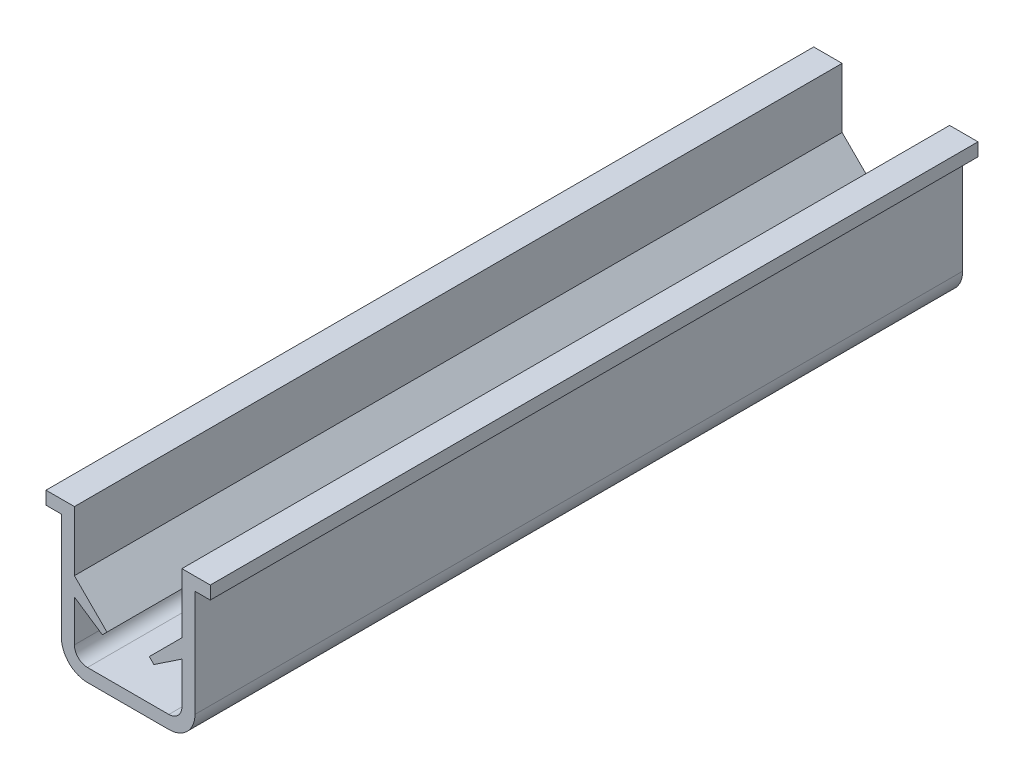
ISO-10303-21;
HEADER;
FILE_DESCRIPTION(('STEP AP214'),'2;1');
FILE_NAME('part.step','',(''),(''),'','','');
FILE_SCHEMA(('AUTOMOTIVE_DESIGN { 1 0 10303 214 1 1 1 1 }'));
ENDSEC;
DATA;
#1=APPLICATION_CONTEXT('core data for automotive mechanical design processes');
#2=APPLICATION_PROTOCOL_DEFINITION('international standard','automotive_design',2000,#1);
#3=PRODUCT_CONTEXT('',#1,'mechanical');
#4=PRODUCT('Part','Part','',(#3));
#5=PRODUCT_RELATED_PRODUCT_CATEGORY('part','',(#4));
#6=PRODUCT_DEFINITION_FORMATION('','',#4);
#7=PRODUCT_DEFINITION_CONTEXT('part definition',#1,'design');
#8=PRODUCT_DEFINITION('design','',#6,#7);
#9=PRODUCT_DEFINITION_SHAPE('','',#8);
#10=(LENGTH_UNIT() NAMED_UNIT(*) SI_UNIT(.MILLI.,.METRE.));
#11=(NAMED_UNIT(*) PLANE_ANGLE_UNIT() SI_UNIT($,.RADIAN.));
#12=(NAMED_UNIT(*) SI_UNIT($,.STERADIAN.) SOLID_ANGLE_UNIT());
#13=UNCERTAINTY_MEASURE_WITH_UNIT(LENGTH_MEASURE(1.E-05),#10,'distance_accuracy_value','');
#14=(GEOMETRIC_REPRESENTATION_CONTEXT(3) GLOBAL_UNCERTAINTY_ASSIGNED_CONTEXT((#13)) GLOBAL_UNIT_ASSIGNED_CONTEXT((#10,
#11,#12)) REPRESENTATION_CONTEXT('',''));
#15=CARTESIAN_POINT('',(0.,0.,0.));
#16=DIRECTION('',(0.,0.,1.));
#17=DIRECTION('',(1.,0.,0.));
#18=AXIS2_PLACEMENT_3D('',#15,#16,#17);
#19=CARTESIAN_POINT('',(-0.947399507109134,-2.0460129960833,50.));
#20=DIRECTION('',(-0.707106781186547,-0.707106781186547,0.));
#21=DIRECTION('',(0.707106781186548,-0.707106781186548,0.));
#22=AXIS2_PLACEMENT_3D('',#19,#20,#21);
#23=PLANE('',#22);
#24=DIRECTION('',(-0.707106781186547,0.707106781186547,0.));
#25=VECTOR('',#24,1.);
#26=CARTESIAN_POINT('',(-0.947399507109134,-2.0460129960833,0.));
#27=LINE('',#26,#25);
#28=CARTESIAN_POINT('',(-0.947399507109134,-2.0460129960833,0.));
#29=VERTEX_POINT('',#28);
#30=CARTESIAN_POINT('',(-3.06871985066814,0.0753073474757116,0.));
#31=VERTEX_POINT('',#30);
#32=EDGE_CURVE('E223',#29,#31,#27,.T.);
#33=ORIENTED_EDGE('',*,*,#32,.T.);
#34=DIRECTION('',(0.,0.,-1.));
#35=VECTOR('',#34,1.);
#36=CARTESIAN_POINT('',(-3.06871985066814,0.0753073474757116,50.));
#37=LINE('',#36,#35);
#38=CARTESIAN_POINT('',(-3.06871985066814,0.0753073474757116,50.));
#39=VERTEX_POINT('',#38);
#40=EDGE_CURVE('E11',#39,#31,#37,.T.);
#41=ORIENTED_EDGE('',*,*,#40,.F.);
#42=DIRECTION('',(-0.707106781186547,0.707106781186547,0.));
#43=VECTOR('',#42,1.);
#44=CARTESIAN_POINT('',(-0.947399507109134,-2.0460129960833,50.));
#45=LINE('',#44,#43);
#46=CARTESIAN_POINT('',(-0.947399507109134,-2.0460129960833,50.));
#47=VERTEX_POINT('',#46);
#48=EDGE_CURVE('E269',#47,#39,#45,.T.);
#49=ORIENTED_EDGE('',*,*,#48,.F.);
#50=DIRECTION('',(0.,0.,-1.));
#51=VECTOR('',#50,1.);
#52=CARTESIAN_POINT('',(-0.947399507109134,-2.0460129960833,50.));
#53=LINE('',#52,#51);
#54=EDGE_CURVE('E219',#47,#29,#53,.T.);
#55=ORIENTED_EDGE('',*,*,#54,.T.);
#56=EDGE_LOOP('',(#33,#41,#49,#55));
#57=FACE_BOUND('',#56,.T.);
#58=ADVANCED_FACE('F31',(#57),#23,.F.);
#59=CARTESIAN_POINT('',(-3.06871985066814,0.0753073474757116,50.));
#60=DIRECTION('',(-1.,0.,0.));
#61=DIRECTION('',(0.,0.,1.));
#62=AXIS2_PLACEMENT_3D('',#59,#60,#61);
#63=PLANE('',#62);
#64=DIRECTION('',(0.,1.,0.));
#65=VECTOR('',#64,1.);
#66=CARTESIAN_POINT('',(-3.06871985066814,0.0753073474757116,0.));
#67=LINE('',#66,#65);
#68=CARTESIAN_POINT('',(-3.06871985066814,3.9753073474755,0.));
#69=VERTEX_POINT('',#68);
#70=EDGE_CURVE('E226',#31,#69,#67,.T.);
#71=ORIENTED_EDGE('',*,*,#70,.T.);
#72=DIRECTION('',(0.,0.,-1.));
#73=VECTOR('',#72,1.);
#74=CARTESIAN_POINT('',(-3.06871985066814,3.9753073474755,50.));
#75=LINE('',#74,#73);
#76=CARTESIAN_POINT('',(-3.06871985066814,3.9753073474755,50.));
#77=VERTEX_POINT('',#76);
#78=EDGE_CURVE('E39',#77,#69,#75,.T.);
#79=ORIENTED_EDGE('',*,*,#78,.F.);
#80=DIRECTION('',(0.,1.,0.));
#81=VECTOR('',#80,1.);
#82=CARTESIAN_POINT('',(-3.06871985066814,0.0753073474757116,50.));
#83=LINE('',#82,#81);
#84=EDGE_CURVE('E138',#39,#77,#83,.T.);
#85=ORIENTED_EDGE('',*,*,#84,.F.);
#86=ORIENTED_EDGE('',*,*,#40,.T.);
#87=EDGE_LOOP('',(#71,#79,#85,#86));
#88=FACE_BOUND('',#87,.T.);
#89=ADVANCED_FACE('F407',(#88),#63,.F.);
#90=CARTESIAN_POINT('',(-3.06871985066814,3.9753073474755,50.));
#91=DIRECTION('',(0.,-1.,0.));
#92=DIRECTION('',(0.,0.,-1.));
#93=AXIS2_PLACEMENT_3D('',#90,#91,#92);
#94=PLANE('',#93);
#95=DIRECTION('',(-1.,0.,0.));
#96=VECTOR('',#95,1.);
#97=CARTESIAN_POINT('',(-3.06871985066814,3.9753073474755,0.));
#98=LINE('',#97,#96);
#99=CARTESIAN_POINT('',(-4.91871985066855,3.9753073474755,0.));
#100=VERTEX_POINT('',#99);
#101=EDGE_CURVE('E228',#69,#100,#98,.T.);
#102=ORIENTED_EDGE('',*,*,#101,.T.);
#103=DIRECTION('',(0.,0.,-1.));
#104=VECTOR('',#103,1.);
#105=CARTESIAN_POINT('',(-4.91871985066855,3.9753073474755,50.));
#106=LINE('',#105,#104);
#107=CARTESIAN_POINT('',(-4.91871985066855,3.9753073474755,50.));
#108=VERTEX_POINT('',#107);
#109=EDGE_CURVE('E324',#108,#100,#106,.T.);
#110=ORIENTED_EDGE('',*,*,#109,.F.);
#111=DIRECTION('',(-1.,0.,0.));
#112=VECTOR('',#111,1.);
#113=CARTESIAN_POINT('',(-3.06871985066814,3.9753073474755,50.));
#114=LINE('',#113,#112);
#115=EDGE_CURVE('E332',#77,#108,#114,.T.);
#116=ORIENTED_EDGE('',*,*,#115,.F.);
#117=ORIENTED_EDGE('',*,*,#78,.T.);
#118=EDGE_LOOP('',(#102,#110,#116,#117));
#119=FACE_BOUND('',#118,.T.);
#120=ADVANCED_FACE('F330',(#119),#94,.F.);
#121=CARTESIAN_POINT('',(-4.91871985066855,3.9753073474755,50.));
#122=DIRECTION('',(1.,0.,0.));
#123=DIRECTION('',(0.,0.,-1.));
#124=AXIS2_PLACEMENT_3D('',#121,#122,#123);
#125=PLANE('',#124);
#126=DIRECTION('',(0.,-1.,0.));
#127=VECTOR('',#126,1.);
#128=CARTESIAN_POINT('',(-4.91871985066855,3.9753073474755,0.));
#129=LINE('',#128,#127);
#130=CARTESIAN_POINT('',(-4.91871985066855,3.12530734747543,0.));
#131=VERTEX_POINT('',#130);
#132=EDGE_CURVE('E230',#100,#131,#129,.T.);
#133=ORIENTED_EDGE('',*,*,#132,.T.);
#134=DIRECTION('',(0.,0.,-1.));
#135=VECTOR('',#134,1.);
#136=CARTESIAN_POINT('',(-4.91871985066855,3.12530734747543,50.));
#137=LINE('',#136,#135);
#138=CARTESIAN_POINT('',(-4.91871985066855,3.12530734747543,50.));
#139=VERTEX_POINT('',#138);
#140=EDGE_CURVE('E321',#139,#131,#137,.T.);
#141=ORIENTED_EDGE('',*,*,#140,.F.);
#142=DIRECTION('',(0.,-1.,0.));
#143=VECTOR('',#142,1.);
#144=CARTESIAN_POINT('',(-4.91871985066855,3.9753073474755,50.));
#145=LINE('',#144,#143);
#146=EDGE_CURVE('E350',#108,#139,#145,.T.);
#147=ORIENTED_EDGE('',*,*,#146,.F.);
#148=ORIENTED_EDGE('',*,*,#109,.T.);
#149=EDGE_LOOP('',(#133,#141,#147,#148));
#150=FACE_BOUND('',#149,.T.);
#151=ADVANCED_FACE('F341',(#150),#125,.F.);
#152=CARTESIAN_POINT('',(-4.91871985066855,3.12530734747543,50.));
#153=DIRECTION('',(0.,1.,0.));
#154=DIRECTION('',(-1.,0.,0.));
#155=AXIS2_PLACEMENT_3D('',#152,#153,#154);
#156=PLANE('',#155);
#157=DIRECTION('',(1.,0.,0.));
#158=VECTOR('',#157,1.);
#159=CARTESIAN_POINT('',(-4.91871985066855,3.12530734747543,0.));
#160=LINE('',#159,#158);
#161=CARTESIAN_POINT('',(-3.91871985066855,3.12530734747546,0.));
#162=VERTEX_POINT('',#161);
#163=EDGE_CURVE('E232',#131,#162,#160,.T.);
#164=ORIENTED_EDGE('',*,*,#163,.T.);
#165=DIRECTION('',(0.,0.,-1.));
#166=VECTOR('',#165,1.);
#167=CARTESIAN_POINT('',(-3.91871985066855,3.12530734747546,50.));
#168=LINE('',#167,#166);
#169=CARTESIAN_POINT('',(-3.91871985066855,3.12530734747546,50.));
#170=VERTEX_POINT('',#169);
#171=EDGE_CURVE('E318',#170,#162,#168,.T.);
#172=ORIENTED_EDGE('',*,*,#171,.F.);
#173=DIRECTION('',(1.,0.,0.));
#174=VECTOR('',#173,1.);
#175=CARTESIAN_POINT('',(-4.91871985066855,3.12530734747543,50.));
#176=LINE('',#175,#174);
#177=EDGE_CURVE('E347',#139,#170,#176,.T.);
#178=ORIENTED_EDGE('',*,*,#177,.F.);
#179=ORIENTED_EDGE('',*,*,#140,.T.);
#180=EDGE_LOOP('',(#164,#172,#178,#179));
#181=FACE_BOUND('',#180,.T.);
#182=ADVANCED_FACE('F345',(#181),#156,.F.);
#183=CARTESIAN_POINT('',(-3.91871985066855,3.12530734747546,50.));
#184=DIRECTION('',(1.,0.,0.));
#185=DIRECTION('',(0.,0.,-1.));
#186=AXIS2_PLACEMENT_3D('',#183,#184,#185);
#187=PLANE('',#186);
#188=DIRECTION('',(0.,-1.,0.));
#189=VECTOR('',#188,1.);
#190=CARTESIAN_POINT('',(-3.91871985066855,3.12530734747546,0.));
#191=LINE('',#190,#189);
#192=CARTESIAN_POINT('',(-3.91871985066855,-3.82469265252469,0.));
#193=VERTEX_POINT('',#192);
#194=EDGE_CURVE('E234',#162,#193,#191,.T.);
#195=ORIENTED_EDGE('',*,*,#194,.T.);
#196=DIRECTION('',(0.,0.,-1.));
#197=VECTOR('',#196,1.);
#198=CARTESIAN_POINT('',(-3.91871985066855,-3.82469265252469,50.));
#199=LINE('',#198,#197);
#200=CARTESIAN_POINT('',(-3.91871985066855,-3.82469265252469,50.));
#201=VERTEX_POINT('',#200);
#202=EDGE_CURVE('E315',#201,#193,#199,.T.);
#203=ORIENTED_EDGE('',*,*,#202,.F.);
#204=DIRECTION('',(0.,-1.,0.));
#205=VECTOR('',#204,1.);
#206=CARTESIAN_POINT('',(-3.91871985066855,3.12530734747546,50.));
#207=LINE('',#206,#205);
#208=EDGE_CURVE('E349',#170,#201,#207,.T.);
#209=ORIENTED_EDGE('',*,*,#208,.F.);
#210=ORIENTED_EDGE('',*,*,#171,.T.);
#211=EDGE_LOOP('',(#195,#203,#209,#210));
#212=FACE_BOUND('',#211,.T.);
#213=ADVANCED_FACE('F420',(#212),#187,.F.);
#214=CARTESIAN_POINT('',(-2.21871985066857,-3.82469265252464,50.));
#215=DIRECTION('',(0.,0.,-1.));
#216=DIRECTION('',(-1.,0.,0.));
#217=AXIS2_PLACEMENT_3D('',#214,#215,#216);
#218=CYLINDRICAL_SURFACE('',#217,1.69999999999998);
#219=CARTESIAN_POINT('',(-2.21871985066857,-3.82469265252464,0.));
#220=DIRECTION('',(0.,0.,1.));
#221=DIRECTION('',(1.,0.,0.));
#222=AXIS2_PLACEMENT_3D('',#219,#220,#221);
#223=CIRCLE('',#222,1.69999999999998);
#224=CARTESIAN_POINT('',(-2.21871985066852,-5.52469265252462,0.));
#225=VERTEX_POINT('',#224);
#226=EDGE_CURVE('E236',#193,#225,#223,.T.);
#227=ORIENTED_EDGE('',*,*,#226,.T.);
#228=DIRECTION('',(0.,0.,-1.));
#229=VECTOR('',#228,1.);
#230=CARTESIAN_POINT('',(-2.21871985066852,-5.52469265252462,50.));
#231=LINE('',#230,#229);
#232=CARTESIAN_POINT('',(-2.21871985066852,-5.52469265252462,50.));
#233=VERTEX_POINT('',#232);
#234=EDGE_CURVE('E312',#233,#225,#231,.T.);
#235=ORIENTED_EDGE('',*,*,#234,.F.);
#236=CARTESIAN_POINT('',(-2.21871985066857,-3.82469265252464,50.));
#237=DIRECTION('',(0.,0.,1.));
#238=DIRECTION('',(1.,0.,0.));
#239=AXIS2_PLACEMENT_3D('',#236,#237,#238);
#240=CIRCLE('',#239,1.69999999999998);
#241=EDGE_CURVE('E352',#201,#233,#240,.T.);
#242=ORIENTED_EDGE('',*,*,#241,.F.);
#243=ORIENTED_EDGE('',*,*,#202,.T.);
#244=EDGE_LOOP('',(#227,#235,#242,#243));
#245=FACE_BOUND('',#244,.T.);
#246=ADVANCED_FACE('F423',(#245),#218,.T.);
#247=CARTESIAN_POINT('',(-2.21871985066852,-5.52469265252462,50.));
#248=DIRECTION('',(0.,1.,0.));
#249=DIRECTION('',(-1.,0.,0.));
#250=AXIS2_PLACEMENT_3D('',#247,#248,#249);
#251=PLANE('',#250);
#252=DIRECTION('',(1.,0.,0.));
#253=VECTOR('',#252,1.);
#254=CARTESIAN_POINT('',(-2.21871985066852,-5.52469265252462,0.));
#255=LINE('',#254,#253);
#256=CARTESIAN_POINT('',(3.08128014933146,-5.5246926525245,0.));
#257=VERTEX_POINT('',#256);
#258=EDGE_CURVE('E238',#225,#257,#255,.T.);
#259=ORIENTED_EDGE('',*,*,#258,.T.);
#260=DIRECTION('',(0.,0.,-1.));
#261=VECTOR('',#260,1.);
#262=CARTESIAN_POINT('',(3.08128014933146,-5.5246926525245,50.));
#263=LINE('',#262,#261);
#264=CARTESIAN_POINT('',(3.08128014933146,-5.5246926525245,50.));
#265=VERTEX_POINT('',#264);
#266=EDGE_CURVE('E309',#265,#257,#263,.T.);
#267=ORIENTED_EDGE('',*,*,#266,.F.);
#268=DIRECTION('',(1.,0.,0.));
#269=VECTOR('',#268,1.);
#270=CARTESIAN_POINT('',(-2.21871985066852,-5.52469265252462,50.));
#271=LINE('',#270,#269);
#272=EDGE_CURVE('E358',#233,#265,#271,.T.);
#273=ORIENTED_EDGE('',*,*,#272,.F.);
#274=ORIENTED_EDGE('',*,*,#234,.T.);
#275=EDGE_LOOP('',(#259,#267,#273,#274));
#276=FACE_BOUND('',#275,.T.);
#277=ADVANCED_FACE('F427',(#276),#251,.F.);
#278=CARTESIAN_POINT('',(3.08128014933218,-3.82469265252275,50.));
#279=DIRECTION('',(0.,0.,-1.));
#280=DIRECTION('',(-1.,0.,0.));
#281=AXIS2_PLACEMENT_3D('',#278,#279,#280);
#282=CYLINDRICAL_SURFACE('',#281,1.70000000000181);
#283=CARTESIAN_POINT('',(3.08128014933218,-3.82469265252275,0.));
#284=DIRECTION('',(0.,0.,1.));
#285=DIRECTION('',(1.,0.,0.));
#286=AXIS2_PLACEMENT_3D('',#283,#284,#285);
#287=CIRCLE('',#286,1.70000000000181);
#288=CARTESIAN_POINT('',(4.78128014933399,-3.82469265252278,0.));
#289=VERTEX_POINT('',#288);
#290=EDGE_CURVE('E240',#257,#289,#287,.T.);
#291=ORIENTED_EDGE('',*,*,#290,.T.);
#292=DIRECTION('',(0.,0.,-1.));
#293=VECTOR('',#292,1.);
#294=CARTESIAN_POINT('',(4.78128014933399,-3.82469265252278,50.));
#295=LINE('',#294,#293);
#296=CARTESIAN_POINT('',(4.78128014933399,-3.82469265252278,50.));
#297=VERTEX_POINT('',#296);
#298=EDGE_CURVE('E306',#297,#289,#295,.T.);
#299=ORIENTED_EDGE('',*,*,#298,.F.);
#300=CARTESIAN_POINT('',(3.08128014933218,-3.82469265252275,50.));
#301=DIRECTION('',(0.,0.,1.));
#302=DIRECTION('',(1.,0.,0.));
#303=AXIS2_PLACEMENT_3D('',#300,#301,#302);
#304=CIRCLE('',#303,1.70000000000181);
#305=EDGE_CURVE('E360',#265,#297,#304,.T.);
#306=ORIENTED_EDGE('',*,*,#305,.F.);
#307=ORIENTED_EDGE('',*,*,#266,.T.);
#308=EDGE_LOOP('',(#291,#299,#306,#307));
#309=FACE_BOUND('',#308,.T.);
#310=ADVANCED_FACE('F431',(#309),#282,.T.);
#311=CARTESIAN_POINT('',(4.78128014933404,-3.82469265252278,50.));
#312=DIRECTION('',(-1.,0.,0.));
#313=DIRECTION('',(0.,0.,1.));
#314=AXIS2_PLACEMENT_3D('',#311,#312,#313);
#315=PLANE('',#314);
#316=DIRECTION('',(0.,1.,0.));
#317=VECTOR('',#316,1.);
#318=CARTESIAN_POINT('',(4.78128014933404,-3.82469265252278,0.));
#319=LINE('',#318,#317);
#320=CARTESIAN_POINT('',(4.78128014933404,3.12530734747712,0.));
#321=VERTEX_POINT('',#320);
#322=EDGE_CURVE('E242',#289,#321,#319,.T.);
#323=ORIENTED_EDGE('',*,*,#322,.T.);
#324=DIRECTION('',(0.,0.,-1.));
#325=VECTOR('',#324,1.);
#326=CARTESIAN_POINT('',(4.78128014933404,3.12530734747712,50.));
#327=LINE('',#326,#325);
#328=CARTESIAN_POINT('',(4.78128014933404,3.12530734747712,50.));
#329=VERTEX_POINT('',#328);
#330=EDGE_CURVE('E303',#329,#321,#327,.T.);
#331=ORIENTED_EDGE('',*,*,#330,.F.);
#332=DIRECTION('',(0.,1.,0.));
#333=VECTOR('',#332,1.);
#334=CARTESIAN_POINT('',(4.78128014933404,-3.82469265252278,50.));
#335=LINE('',#334,#333);
#336=EDGE_CURVE('E362',#297,#329,#335,.T.);
#337=ORIENTED_EDGE('',*,*,#336,.F.);
#338=ORIENTED_EDGE('',*,*,#298,.T.);
#339=EDGE_LOOP('',(#323,#331,#337,#338));
#340=FACE_BOUND('',#339,.T.);
#341=ADVANCED_FACE('F435',(#340),#315,.F.);
#342=CARTESIAN_POINT('',(4.78128014933404,3.12530734747712,50.));
#343=DIRECTION('',(0.,1.,0.));
#344=DIRECTION('',(0.,0.,1.));
#345=AXIS2_PLACEMENT_3D('',#342,#343,#344);
#346=PLANE('',#345);
#347=DIRECTION('',(1.,0.,0.));
#348=VECTOR('',#347,1.);
#349=CARTESIAN_POINT('',(4.78128014933404,3.12530734747712,0.));
#350=LINE('',#349,#348);
#351=CARTESIAN_POINT('',(5.78128014933404,3.12530734747712,0.));
#352=VERTEX_POINT('',#351);
#353=EDGE_CURVE('E244',#321,#352,#350,.T.);
#354=ORIENTED_EDGE('',*,*,#353,.T.);
#355=DIRECTION('',(0.,0.,-1.));
#356=VECTOR('',#355,1.);
#357=CARTESIAN_POINT('',(5.78128014933404,3.12530734747712,50.));
#358=LINE('',#357,#356);
#359=CARTESIAN_POINT('',(5.78128014933404,3.12530734747712,50.));
#360=VERTEX_POINT('',#359);
#361=EDGE_CURVE('E300',#360,#352,#358,.T.);
#362=ORIENTED_EDGE('',*,*,#361,.F.);
#363=DIRECTION('',(1.,0.,0.));
#364=VECTOR('',#363,1.);
#365=CARTESIAN_POINT('',(4.78128014933404,3.12530734747712,50.));
#366=LINE('',#365,#364);
#367=EDGE_CURVE('E364',#329,#360,#366,.T.);
#368=ORIENTED_EDGE('',*,*,#367,.F.);
#369=ORIENTED_EDGE('',*,*,#330,.T.);
#370=EDGE_LOOP('',(#354,#362,#368,#369));
#371=FACE_BOUND('',#370,.T.);
#372=ADVANCED_FACE('F439',(#371),#346,.F.);
#373=CARTESIAN_POINT('',(5.78128014933404,3.12530734747712,50.));
#374=DIRECTION('',(-1.,0.,0.));
#375=DIRECTION('',(0.,0.,1.));
#376=AXIS2_PLACEMENT_3D('',#373,#374,#375);
#377=PLANE('',#376);
#378=DIRECTION('',(0.,1.,0.));
#379=VECTOR('',#378,1.);
#380=CARTESIAN_POINT('',(5.78128014933404,3.12530734747712,0.));
#381=LINE('',#380,#379);
#382=CARTESIAN_POINT('',(5.78128014933404,3.9753073474777,0.));
#383=VERTEX_POINT('',#382);
#384=EDGE_CURVE('E246',#352,#383,#381,.T.);
#385=ORIENTED_EDGE('',*,*,#384,.T.);
#386=DIRECTION('',(0.,0.,-1.));
#387=VECTOR('',#386,1.);
#388=CARTESIAN_POINT('',(5.78128014933404,3.9753073474777,50.));
#389=LINE('',#388,#387);
#390=CARTESIAN_POINT('',(5.78128014933404,3.9753073474777,50.));
#391=VERTEX_POINT('',#390);
#392=EDGE_CURVE('E297',#391,#383,#389,.T.);
#393=ORIENTED_EDGE('',*,*,#392,.F.);
#394=DIRECTION('',(0.,1.,0.));
#395=VECTOR('',#394,1.);
#396=CARTESIAN_POINT('',(5.78128014933404,3.12530734747712,50.));
#397=LINE('',#396,#395);
#398=EDGE_CURVE('E366',#360,#391,#397,.T.);
#399=ORIENTED_EDGE('',*,*,#398,.F.);
#400=ORIENTED_EDGE('',*,*,#361,.T.);
#401=EDGE_LOOP('',(#385,#393,#399,#400));
#402=FACE_BOUND('',#401,.T.);
#403=ADVANCED_FACE('F443',(#402),#377,.F.);
#404=CARTESIAN_POINT('',(5.78128014933404,3.9753073474777,50.));
#405=DIRECTION('',(0.,-1.,0.));
#406=DIRECTION('',(0.,0.,-1.));
#407=AXIS2_PLACEMENT_3D('',#404,#405,#406);
#408=PLANE('',#407);
#409=DIRECTION('',(-1.,0.,0.));
#410=VECTOR('',#409,1.);
#411=CARTESIAN_POINT('',(5.78128014933404,3.9753073474777,0.));
#412=LINE('',#411,#410);
#413=CARTESIAN_POINT('',(3.93128014933306,3.9753073474777,0.));
#414=VERTEX_POINT('',#413);
#415=EDGE_CURVE('E248',#383,#414,#412,.T.);
#416=ORIENTED_EDGE('',*,*,#415,.T.);
#417=DIRECTION('',(0.,0.,-1.));
#418=VECTOR('',#417,1.);
#419=CARTESIAN_POINT('',(3.93128014933306,3.9753073474777,50.));
#420=LINE('',#419,#418);
#421=CARTESIAN_POINT('',(3.93128014933306,3.9753073474777,50.));
#422=VERTEX_POINT('',#421);
#423=EDGE_CURVE('E294',#422,#414,#420,.T.);
#424=ORIENTED_EDGE('',*,*,#423,.F.);
#425=DIRECTION('',(-1.,0.,0.));
#426=VECTOR('',#425,1.);
#427=CARTESIAN_POINT('',(5.78128014933404,3.9753073474777,50.));
#428=LINE('',#427,#426);
#429=EDGE_CURVE('E368',#391,#422,#428,.T.);
#430=ORIENTED_EDGE('',*,*,#429,.F.);
#431=ORIENTED_EDGE('',*,*,#392,.T.);
#432=EDGE_LOOP('',(#416,#424,#430,#431));
#433=FACE_BOUND('',#432,.T.);
#434=ADVANCED_FACE('F447',(#433),#408,.F.);
#435=CARTESIAN_POINT('',(3.93128014933306,3.9753073474777,50.));
#436=DIRECTION('',(1.,0.,0.));
#437=DIRECTION('',(0.,0.,-1.));
#438=AXIS2_PLACEMENT_3D('',#435,#436,#437);
#439=PLANE('',#438);
#440=DIRECTION('',(0.,-1.,0.));
#441=VECTOR('',#440,1.);
#442=CARTESIAN_POINT('',(3.93128014933306,3.9753073474777,0.));
#443=LINE('',#442,#441);
#444=CARTESIAN_POINT('',(3.93128014933306,0.0753073474759613,0.));
#445=VERTEX_POINT('',#444);
#446=EDGE_CURVE('E250',#414,#445,#443,.T.);
#447=ORIENTED_EDGE('',*,*,#446,.T.);
#448=DIRECTION('',(0.,0.,-1.));
#449=VECTOR('',#448,1.);
#450=CARTESIAN_POINT('',(3.93128014933306,0.0753073474759613,50.));
#451=LINE('',#450,#449);
#452=CARTESIAN_POINT('',(3.93128014933306,0.0753073474759613,50.));
#453=VERTEX_POINT('',#452);
#454=EDGE_CURVE('E291',#453,#445,#451,.T.);
#455=ORIENTED_EDGE('',*,*,#454,.F.);
#456=DIRECTION('',(0.,-1.,0.));
#457=VECTOR('',#456,1.);
#458=CARTESIAN_POINT('',(3.93128014933306,3.9753073474777,50.));
#459=LINE('',#458,#457);
#460=EDGE_CURVE('E370',#422,#453,#459,.T.);
#461=ORIENTED_EDGE('',*,*,#460,.F.);
#462=ORIENTED_EDGE('',*,*,#423,.T.);
#463=EDGE_LOOP('',(#447,#455,#461,#462));
#464=FACE_BOUND('',#463,.T.);
#465=ADVANCED_FACE('F451',(#464),#439,.F.);
#466=CARTESIAN_POINT('',(3.93128014933306,0.0753073474759613,50.));
#467=DIRECTION('',(0.707106781186547,-0.707106781186547,0.));
#468=DIRECTION('',(0.707106781186548,0.707106781186548,0.));
#469=AXIS2_PLACEMENT_3D('',#466,#467,#468);
#470=PLANE('',#469);
#471=DIRECTION('',(-0.707106781186547,-0.707106781186547,0.));
#472=VECTOR('',#471,1.);
#473=CARTESIAN_POINT('',(3.93128014933306,0.0753073474759613,0.));
#474=LINE('',#473,#472);
#475=CARTESIAN_POINT('',(1.80995980577503,-2.04601299608206,0.));
#476=VERTEX_POINT('',#475);
#477=EDGE_CURVE('E252',#445,#476,#474,.T.);
#478=ORIENTED_EDGE('',*,*,#477,.T.);
#479=DIRECTION('',(0.,0.,-1.));
#480=VECTOR('',#479,1.);
#481=CARTESIAN_POINT('',(1.80995980577503,-2.04601299608206,50.));
#482=LINE('',#481,#480);
#483=CARTESIAN_POINT('',(1.80995980577503,-2.04601299608206,50.));
#484=VERTEX_POINT('',#483);
#485=EDGE_CURVE('E288',#484,#476,#482,.T.);
#486=ORIENTED_EDGE('',*,*,#485,.F.);
#487=DIRECTION('',(-0.707106781186547,-0.707106781186547,0.));
#488=VECTOR('',#487,1.);
#489=CARTESIAN_POINT('',(3.93128014933306,0.0753073474759613,50.));
#490=LINE('',#489,#488);
#491=EDGE_CURVE('E372',#453,#484,#490,.T.);
#492=ORIENTED_EDGE('',*,*,#491,.F.);
#493=ORIENTED_EDGE('',*,*,#454,.T.);
#494=EDGE_LOOP('',(#478,#486,#492,#493));
#495=FACE_BOUND('',#494,.T.);
#496=ADVANCED_FACE('F455',(#495),#470,.F.);
#497=CARTESIAN_POINT('',(1.80995980577503,-2.04601299608206,50.));
#498=DIRECTION('',(0.707106781186548,0.707106781186548,0.));
#499=DIRECTION('',(-0.707106781186548,0.707106781186548,0.));
#500=AXIS2_PLACEMENT_3D('',#497,#498,#499);
#501=PLANE('',#500);
#502=DIRECTION('',(0.707106781186548,-0.707106781186548,0.));
#503=VECTOR('',#502,1.);
#504=CARTESIAN_POINT('',(1.80995980577503,-2.04601299608206,0.));
#505=LINE('',#504,#503);
#506=CARTESIAN_POINT('',(2.11048018777957,-2.3465333780866,0.));
#507=VERTEX_POINT('',#506);
#508=EDGE_CURVE('E254',#476,#507,#505,.T.);
#509=ORIENTED_EDGE('',*,*,#508,.T.);
#510=DIRECTION('',(0.,0.,-1.));
#511=VECTOR('',#510,1.);
#512=CARTESIAN_POINT('',(2.11048018777957,-2.3465333780866,50.));
#513=LINE('',#512,#511);
#514=CARTESIAN_POINT('',(2.11048018777957,-2.3465333780866,50.));
#515=VERTEX_POINT('',#514);
#516=EDGE_CURVE('E285',#515,#507,#513,.T.);
#517=ORIENTED_EDGE('',*,*,#516,.F.);
#518=DIRECTION('',(0.707106781186548,-0.707106781186548,0.));
#519=VECTOR('',#518,1.);
#520=CARTESIAN_POINT('',(1.80995980577503,-2.04601299608206,50.));
#521=LINE('',#520,#519);
#522=EDGE_CURVE('E374',#484,#515,#521,.T.);
#523=ORIENTED_EDGE('',*,*,#522,.F.);
#524=ORIENTED_EDGE('',*,*,#485,.T.);
#525=EDGE_LOOP('',(#509,#517,#523,#524));
#526=FACE_BOUND('',#525,.T.);
#527=ADVANCED_FACE('F459',(#526),#501,.F.);
#528=CARTESIAN_POINT('',(2.11048018777957,-2.3465333780866,50.));
#529=DIRECTION('',(-0.556560213550804,0.830807275300526,0.));
#530=DIRECTION('',(-0.830807275300526,-0.556560213550804,0.));
#531=AXIS2_PLACEMENT_3D('',#528,#529,#530);
#532=PLANE('',#531);
#533=DIRECTION('',(0.830807275300525,0.556560213550804,0.));
#534=VECTOR('',#533,1.);
#535=CARTESIAN_POINT('',(2.11048018777957,-2.3465333780866,0.));
#536=LINE('',#535,#534);
#537=CARTESIAN_POINT('',(3.93128014933289,-1.12677418054125,0.));
#538=VERTEX_POINT('',#537);
#539=EDGE_CURVE('E256',#507,#538,#536,.T.);
#540=ORIENTED_EDGE('',*,*,#539,.T.);
#541=DIRECTION('',(0.,0.,-1.));
#542=VECTOR('',#541,1.);
#543=CARTESIAN_POINT('',(3.93128014933289,-1.12677418054125,50.));
#544=LINE('',#543,#542);
#545=CARTESIAN_POINT('',(3.93128014933289,-1.12677418054125,50.));
#546=VERTEX_POINT('',#545);
#547=EDGE_CURVE('E282',#546,#538,#544,.T.);
#548=ORIENTED_EDGE('',*,*,#547,.F.);
#549=DIRECTION('',(0.830807275300525,0.556560213550804,0.));
#550=VECTOR('',#549,1.);
#551=CARTESIAN_POINT('',(2.11048018777957,-2.3465333780866,50.));
#552=LINE('',#551,#550);
#553=EDGE_CURVE('E376',#515,#546,#552,.T.);
#554=ORIENTED_EDGE('',*,*,#553,.F.);
#555=ORIENTED_EDGE('',*,*,#516,.T.);
#556=EDGE_LOOP('',(#540,#548,#554,#555));
#557=FACE_BOUND('',#556,.T.);
#558=ADVANCED_FACE('F463',(#557),#532,.F.);
#559=CARTESIAN_POINT('',(3.93128014933289,-1.12677418054125,50.));
#560=DIRECTION('',(1.,0.,0.));
#561=DIRECTION('',(0.,0.,-1.));
#562=AXIS2_PLACEMENT_3D('',#559,#560,#561);
#563=PLANE('',#562);
#564=DIRECTION('',(0.,-1.,0.));
#565=VECTOR('',#564,1.);
#566=CARTESIAN_POINT('',(3.93128014933289,-1.12677418054125,0.));
#567=LINE('',#566,#565);
#568=CARTESIAN_POINT('',(3.93128014933289,-3.82469265252258,0.));
#569=VERTEX_POINT('',#568);
#570=EDGE_CURVE('E258',#538,#569,#567,.T.);
#571=ORIENTED_EDGE('',*,*,#570,.T.);
#572=DIRECTION('',(0.,0.,-1.));
#573=VECTOR('',#572,1.);
#574=CARTESIAN_POINT('',(3.93128014933289,-3.82469265252258,50.));
#575=LINE('',#574,#573);
#576=CARTESIAN_POINT('',(3.93128014933289,-3.82469265252258,50.));
#577=VERTEX_POINT('',#576);
#578=EDGE_CURVE('E279',#577,#569,#575,.T.);
#579=ORIENTED_EDGE('',*,*,#578,.F.);
#580=DIRECTION('',(0.,-1.,0.));
#581=VECTOR('',#580,1.);
#582=CARTESIAN_POINT('',(3.93128014933289,-1.12677418054125,50.));
#583=LINE('',#582,#581);
#584=EDGE_CURVE('E378',#546,#577,#583,.T.);
#585=ORIENTED_EDGE('',*,*,#584,.F.);
#586=ORIENTED_EDGE('',*,*,#547,.T.);
#587=EDGE_LOOP('',(#571,#579,#585,#586));
#588=FACE_BOUND('',#587,.T.);
#589=ADVANCED_FACE('F467',(#588),#563,.F.);
#590=CARTESIAN_POINT('',(3.08128014933218,-3.82469265252275,50.));
#591=DIRECTION('',(0.,0.,-1.));
#592=DIRECTION('',(-1.,0.,0.));
#593=AXIS2_PLACEMENT_3D('',#590,#591,#592);
#594=CYLINDRICAL_SURFACE('',#593,0.850000000000711);
#595=CARTESIAN_POINT('',(3.08128014933218,-3.82469265252275,0.));
#596=DIRECTION('',(0.,0.,-1.));
#597=DIRECTION('',(1.,0.,0.));
#598=AXIS2_PLACEMENT_3D('',#595,#596,#597);
#599=CIRCLE('',#598,0.850000000000711);
#600=CARTESIAN_POINT('',(3.08128014933329,-4.67469265252346,0.));
#601=VERTEX_POINT('',#600);
#602=EDGE_CURVE('E260',#569,#601,#599,.T.);
#603=ORIENTED_EDGE('',*,*,#602,.T.);
#604=DIRECTION('',(0.,0.,-1.));
#605=VECTOR('',#604,1.);
#606=CARTESIAN_POINT('',(3.08128014933329,-4.67469265252346,50.));
#607=LINE('',#606,#605);
#608=CARTESIAN_POINT('',(3.08128014933329,-4.67469265252346,50.));
#609=VERTEX_POINT('',#608);
#610=EDGE_CURVE('E276',#609,#601,#607,.T.);
#611=ORIENTED_EDGE('',*,*,#610,.F.);
#612=CARTESIAN_POINT('',(3.08128014933218,-3.82469265252275,50.));
#613=DIRECTION('',(0.,0.,-1.));
#614=DIRECTION('',(1.,0.,0.));
#615=AXIS2_PLACEMENT_3D('',#612,#613,#614);
#616=CIRCLE('',#615,0.850000000000711);
#617=EDGE_CURVE('E380',#577,#609,#616,.T.);
#618=ORIENTED_EDGE('',*,*,#617,.F.);
#619=ORIENTED_EDGE('',*,*,#578,.T.);
#620=EDGE_LOOP('',(#603,#611,#618,#619));
#621=FACE_BOUND('',#620,.T.);
#622=ADVANCED_FACE('F471',(#621),#594,.F.);
#623=CARTESIAN_POINT('',(3.08128014933329,-4.67469265252346,50.));
#624=DIRECTION('',(0.,-1.,0.));
#625=DIRECTION('',(0.,0.,-1.));
#626=AXIS2_PLACEMENT_3D('',#623,#624,#625);
#627=PLANE('',#626);
#628=DIRECTION('',(-1.,0.,0.));
#629=VECTOR('',#628,1.);
#630=CARTESIAN_POINT('',(3.08128014933329,-4.67469265252346,0.));
#631=LINE('',#630,#629);
#632=CARTESIAN_POINT('',(-2.21871985066785,-4.67469265252346,0.));
#633=VERTEX_POINT('',#632);
#634=EDGE_CURVE('E262',#601,#633,#631,.T.);
#635=ORIENTED_EDGE('',*,*,#634,.T.);
#636=DIRECTION('',(0.,0.,-1.));
#637=VECTOR('',#636,1.);
#638=CARTESIAN_POINT('',(-2.21871985066785,-4.67469265252346,50.));
#639=LINE('',#638,#637);
#640=CARTESIAN_POINT('',(-2.21871985066785,-4.67469265252346,50.));
#641=VERTEX_POINT('',#640);
#642=EDGE_CURVE('E273',#641,#633,#639,.T.);
#643=ORIENTED_EDGE('',*,*,#642,.F.);
#644=DIRECTION('',(-1.,0.,0.));
#645=VECTOR('',#644,1.);
#646=CARTESIAN_POINT('',(3.08128014933329,-4.67469265252346,50.));
#647=LINE('',#646,#645);
#648=EDGE_CURVE('E382',#609,#641,#647,.T.);
#649=ORIENTED_EDGE('',*,*,#648,.F.);
#650=ORIENTED_EDGE('',*,*,#610,.T.);
#651=EDGE_LOOP('',(#635,#643,#649,#650));
#652=FACE_BOUND('',#651,.T.);
#653=ADVANCED_FACE('F388',(#652),#627,.F.);
#654=CARTESIAN_POINT('',(-2.21871985066857,-3.82469265252464,50.));
#655=DIRECTION('',(0.,0.,-1.));
#656=DIRECTION('',(-1.,0.,0.));
#657=AXIS2_PLACEMENT_3D('',#654,#655,#656);
#658=CYLINDRICAL_SURFACE('',#657,0.849999999998824);
#659=CARTESIAN_POINT('',(-2.21871985066857,-3.82469265252464,0.));
#660=DIRECTION('',(0.,0.,-1.));
#661=DIRECTION('',(1.,0.,0.));
#662=AXIS2_PLACEMENT_3D('',#659,#660,#661);
#663=CIRCLE('',#662,0.849999999998824);
#664=CARTESIAN_POINT('',(-3.06871985066739,-3.8246926525245,0.));
#665=VERTEX_POINT('',#664);
#666=EDGE_CURVE('E264',#633,#665,#663,.T.);
#667=ORIENTED_EDGE('',*,*,#666,.T.);
#668=DIRECTION('',(0.,0.,-1.));
#669=VECTOR('',#668,1.);
#670=CARTESIAN_POINT('',(-3.06871985066739,-3.8246926525245,50.));
#671=LINE('',#670,#669);
#672=CARTESIAN_POINT('',(-3.06871985066739,-3.8246926525245,50.));
#673=VERTEX_POINT('',#672);
#674=EDGE_CURVE('E214',#673,#665,#671,.T.);
#675=ORIENTED_EDGE('',*,*,#674,.F.);
#676=CARTESIAN_POINT('',(-2.21871985066857,-3.82469265252464,50.));
#677=DIRECTION('',(0.,0.,-1.));
#678=DIRECTION('',(1.,0.,0.));
#679=AXIS2_PLACEMENT_3D('',#676,#677,#678);
#680=CIRCLE('',#679,0.849999999998824);
#681=EDGE_CURVE('E205',#641,#673,#680,.T.);
#682=ORIENTED_EDGE('',*,*,#681,.F.);
#683=ORIENTED_EDGE('',*,*,#642,.T.);
#684=EDGE_LOOP('',(#667,#675,#682,#683));
#685=FACE_BOUND('',#684,.T.);
#686=ADVANCED_FACE('F392',(#685),#658,.F.);
#687=CARTESIAN_POINT('',(-3.06871985066739,-3.8246926525245,50.));
#688=DIRECTION('',(-1.,0.,0.));
#689=DIRECTION('',(0.,0.,1.));
#690=AXIS2_PLACEMENT_3D('',#687,#688,#689);
#691=PLANE('',#690);
#692=DIRECTION('',(0.,1.,0.));
#693=VECTOR('',#692,1.);
#694=CARTESIAN_POINT('',(-3.06871985066739,-3.8246926525245,0.));
#695=LINE('',#694,#693);
#696=CARTESIAN_POINT('',(-3.06871985066739,-1.12677418054305,0.));
#697=VERTEX_POINT('',#696);
#698=EDGE_CURVE('E213',#665,#697,#695,.T.);
#699=ORIENTED_EDGE('',*,*,#698,.T.);
#700=DIRECTION('',(0.,0.,-1.));
#701=VECTOR('',#700,1.);
#702=CARTESIAN_POINT('',(-3.06871985066739,-1.12677418054305,50.));
#703=LINE('',#702,#701);
#704=CARTESIAN_POINT('',(-3.06871985066739,-1.12677418054305,50.));
#705=VERTEX_POINT('',#704);
#706=EDGE_CURVE('E210',#705,#697,#703,.T.);
#707=ORIENTED_EDGE('',*,*,#706,.F.);
#708=DIRECTION('',(0.,1.,0.));
#709=VECTOR('',#708,1.);
#710=CARTESIAN_POINT('',(-3.06871985066739,-3.8246926525245,50.));
#711=LINE('',#710,#709);
#712=EDGE_CURVE('E199',#673,#705,#711,.T.);
#713=ORIENTED_EDGE('',*,*,#712,.F.);
#714=ORIENTED_EDGE('',*,*,#674,.T.);
#715=EDGE_LOOP('',(#699,#707,#713,#714));
#716=FACE_BOUND('',#715,.T.);
#717=ADVANCED_FACE('F211',(#716),#691,.F.);
#718=CARTESIAN_POINT('',(-3.06871985066739,-1.12677418054305,50.));
#719=DIRECTION('',(0.55656021355081,0.830807275300522,0.));
#720=DIRECTION('',(-0.830807275300522,0.55656021355081,0.));
#721=AXIS2_PLACEMENT_3D('',#718,#719,#720);
#722=PLANE('',#721);
#723=DIRECTION('',(0.830807275300522,-0.55656021355081,0.));
#724=VECTOR('',#723,1.);
#725=CARTESIAN_POINT('',(-3.06871985066739,-1.12677418054305,0.));
#726=LINE('',#725,#724);
#727=CARTESIAN_POINT('',(-1.24791988911419,-2.34653337808835,0.));
#728=VERTEX_POINT('',#727);
#729=EDGE_CURVE('E124',#697,#728,#726,.T.);
#730=ORIENTED_EDGE('',*,*,#729,.T.);
#731=DIRECTION('',(0.,0.,-1.));
#732=VECTOR('',#731,1.);
#733=CARTESIAN_POINT('',(-1.24791988911419,-2.34653337808835,50.));
#734=LINE('',#733,#732);
#735=CARTESIAN_POINT('',(-1.24791988911419,-2.34653337808835,50.));
#736=VERTEX_POINT('',#735);
#737=EDGE_CURVE('E215',#736,#728,#734,.T.);
#738=ORIENTED_EDGE('',*,*,#737,.F.);
#739=DIRECTION('',(0.830807275300522,-0.55656021355081,0.));
#740=VECTOR('',#739,1.);
#741=CARTESIAN_POINT('',(-3.06871985066739,-1.12677418054305,50.));
#742=LINE('',#741,#740);
#743=EDGE_CURVE('E203',#705,#736,#742,.T.);
#744=ORIENTED_EDGE('',*,*,#743,.F.);
#745=ORIENTED_EDGE('',*,*,#706,.T.);
#746=EDGE_LOOP('',(#730,#738,#744,#745));
#747=FACE_BOUND('',#746,.T.);
#748=ADVANCED_FACE('F217',(#747),#722,.F.);
#749=CARTESIAN_POINT('',(-1.24791988911419,-2.34653337808835,50.));
#750=DIRECTION('',(-0.707106781186548,0.707106781186548,0.));
#751=DIRECTION('',(-0.707106781186548,-0.707106781186548,0.));
#752=AXIS2_PLACEMENT_3D('',#749,#750,#751);
#753=PLANE('',#752);
#754=DIRECTION('',(0.707106781186548,0.707106781186548,0.));
#755=VECTOR('',#754,1.);
#756=CARTESIAN_POINT('',(-1.24791988911419,-2.34653337808835,0.));
#757=LINE('',#756,#755);
#758=EDGE_CURVE('E130',#728,#29,#757,.T.);
#759=ORIENTED_EDGE('',*,*,#758,.T.);
#760=ORIENTED_EDGE('',*,*,#54,.F.);
#761=DIRECTION('',(0.707106781186548,0.707106781186548,0.));
#762=VECTOR('',#761,1.);
#763=CARTESIAN_POINT('',(-1.24791988911419,-2.34653337808835,50.));
#764=LINE('',#763,#762);
#765=EDGE_CURVE('E47',#736,#47,#764,.T.);
#766=ORIENTED_EDGE('',*,*,#765,.F.);
#767=ORIENTED_EDGE('',*,*,#737,.T.);
#768=EDGE_LOOP('',(#759,#760,#766,#767));
#769=FACE_BOUND('',#768,.T.);
#770=ADVANCED_FACE('F396',(#769),#753,.F.);
#771=CARTESIAN_POINT('',(-2.21871985066857,-3.82469265252464,50.));
#772=DIRECTION('',(0.,0.,1.));
#773=DIRECTION('',(1.,0.,0.));
#774=AXIS2_PLACEMENT_3D('',#771,#772,#773);
#775=PLANE('',#774);
#776=ORIENTED_EDGE('',*,*,#48,.T.);
#777=ORIENTED_EDGE('',*,*,#84,.T.);
#778=ORIENTED_EDGE('',*,*,#115,.T.);
#779=ORIENTED_EDGE('',*,*,#146,.T.);
#780=ORIENTED_EDGE('',*,*,#177,.T.);
#781=ORIENTED_EDGE('',*,*,#208,.T.);
#782=ORIENTED_EDGE('',*,*,#241,.T.);
#783=ORIENTED_EDGE('',*,*,#272,.T.);
#784=ORIENTED_EDGE('',*,*,#305,.T.);
#785=ORIENTED_EDGE('',*,*,#336,.T.);
#786=ORIENTED_EDGE('',*,*,#367,.T.);
#787=ORIENTED_EDGE('',*,*,#398,.T.);
#788=ORIENTED_EDGE('',*,*,#429,.T.);
#789=ORIENTED_EDGE('',*,*,#460,.T.);
#790=ORIENTED_EDGE('',*,*,#491,.T.);
#791=ORIENTED_EDGE('',*,*,#522,.T.);
#792=ORIENTED_EDGE('',*,*,#553,.T.);
#793=ORIENTED_EDGE('',*,*,#584,.T.);
#794=ORIENTED_EDGE('',*,*,#617,.T.);
#795=ORIENTED_EDGE('',*,*,#648,.T.);
#796=ORIENTED_EDGE('',*,*,#681,.T.);
#797=ORIENTED_EDGE('',*,*,#712,.T.);
#798=ORIENTED_EDGE('',*,*,#743,.T.);
#799=ORIENTED_EDGE('',*,*,#765,.T.);
#800=EDGE_LOOP('',(#776,#777,#778,#779,#780,#781,#782,#783,#784,#785,#786,#787,#788,#789,#790,
#791,#792,#793,#794,#795,#796,#797,#798,#799));
#801=FACE_BOUND('',#800,.T.);
#802=ADVANCED_FACE('F201',(#801),#775,.T.);
#803=CARTESIAN_POINT('',(-2.21871985066857,-3.82469265252464,0.));
#804=DIRECTION('',(0.,0.,1.));
#805=DIRECTION('',(1.,0.,0.));
#806=AXIS2_PLACEMENT_3D('',#803,#804,#805);
#807=PLANE('',#806);
#808=ORIENTED_EDGE('',*,*,#32,.F.);
#809=ORIENTED_EDGE('',*,*,#758,.F.);
#810=ORIENTED_EDGE('',*,*,#729,.F.);
#811=ORIENTED_EDGE('',*,*,#698,.F.);
#812=ORIENTED_EDGE('',*,*,#666,.F.);
#813=ORIENTED_EDGE('',*,*,#634,.F.);
#814=ORIENTED_EDGE('',*,*,#602,.F.);
#815=ORIENTED_EDGE('',*,*,#570,.F.);
#816=ORIENTED_EDGE('',*,*,#539,.F.);
#817=ORIENTED_EDGE('',*,*,#508,.F.);
#818=ORIENTED_EDGE('',*,*,#477,.F.);
#819=ORIENTED_EDGE('',*,*,#446,.F.);
#820=ORIENTED_EDGE('',*,*,#415,.F.);
#821=ORIENTED_EDGE('',*,*,#384,.F.);
#822=ORIENTED_EDGE('',*,*,#353,.F.);
#823=ORIENTED_EDGE('',*,*,#322,.F.);
#824=ORIENTED_EDGE('',*,*,#290,.F.);
#825=ORIENTED_EDGE('',*,*,#258,.F.);
#826=ORIENTED_EDGE('',*,*,#226,.F.);
#827=ORIENTED_EDGE('',*,*,#194,.F.);
#828=ORIENTED_EDGE('',*,*,#163,.F.);
#829=ORIENTED_EDGE('',*,*,#132,.F.);
#830=ORIENTED_EDGE('',*,*,#101,.F.);
#831=ORIENTED_EDGE('',*,*,#70,.F.);
#832=EDGE_LOOP('',(#808,#809,#810,#811,#812,#813,#814,#815,#816,#817,#818,#819,#820,#821,#822,
#823,#824,#825,#826,#827,#828,#829,#830,#831));
#833=FACE_BOUND('',#832,.T.);
#834=ADVANCED_FACE('F336',(#833),#807,.F.);
#835=CLOSED_SHELL('',(#58,#89,#120,#151,#182,#213,#246,#277,#310,#341,#372,#403,#434,#465,#496,
#527,#558,#589,#622,#653,#686,#717,#748,#770,#802,#834));
#836=MANIFOLD_SOLID_BREP('B2',#835);
#837=ADVANCED_BREP_SHAPE_REPRESENTATION('',(#18,#836),#14);
#838=SHAPE_DEFINITION_REPRESENTATION(#9,#837);
ENDSEC;
END-ISO-10303-21;
